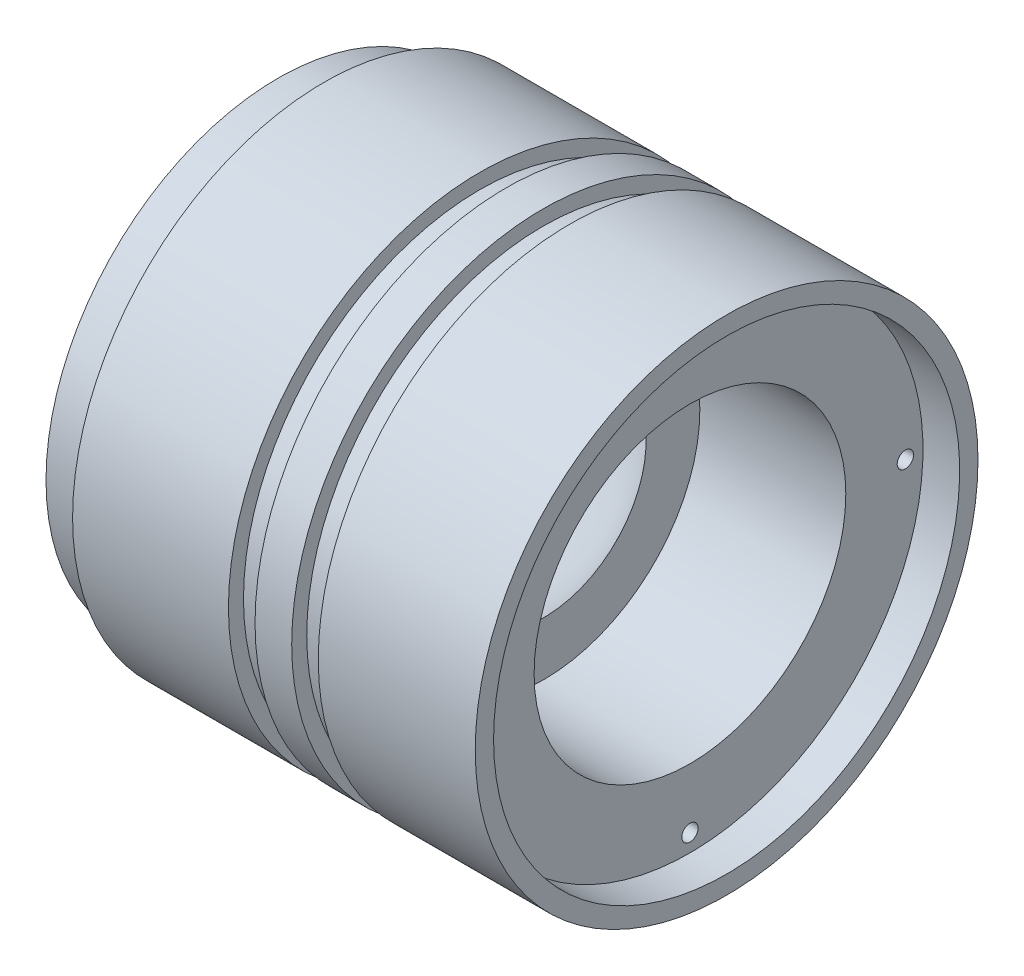
ISO-10303-21;
HEADER;
FILE_DESCRIPTION(('STEP AP214'),'2;1');
FILE_NAME('part.step','',(''),(''),'','','');
FILE_SCHEMA(('AUTOMOTIVE_DESIGN { 1 0 10303 214 1 1 1 1 }'));
ENDSEC;
DATA;
#1=APPLICATION_CONTEXT('core data for automotive mechanical design processes');
#2=APPLICATION_PROTOCOL_DEFINITION('international standard','automotive_design',2000,#1);
#3=PRODUCT_CONTEXT('',#1,'mechanical');
#4=PRODUCT('Part','Part','',(#3));
#5=PRODUCT_RELATED_PRODUCT_CATEGORY('part','',(#4));
#6=PRODUCT_DEFINITION_FORMATION('','',#4);
#7=PRODUCT_DEFINITION_CONTEXT('part definition',#1,'design');
#8=PRODUCT_DEFINITION('design','',#6,#7);
#9=PRODUCT_DEFINITION_SHAPE('','',#8);
#10=(LENGTH_UNIT() NAMED_UNIT(*) SI_UNIT(.MILLI.,.METRE.));
#11=(NAMED_UNIT(*) PLANE_ANGLE_UNIT() SI_UNIT($,.RADIAN.));
#12=(NAMED_UNIT(*) SI_UNIT($,.STERADIAN.) SOLID_ANGLE_UNIT());
#13=UNCERTAINTY_MEASURE_WITH_UNIT(LENGTH_MEASURE(1.E-05),#10,'distance_accuracy_value','');
#14=(GEOMETRIC_REPRESENTATION_CONTEXT(3) GLOBAL_UNCERTAINTY_ASSIGNED_CONTEXT((#13)) GLOBAL_UNIT_ASSIGNED_CONTEXT((#10,
#11,#12)) REPRESENTATION_CONTEXT('',''));
#15=CARTESIAN_POINT('',(0.,0.,0.));
#16=DIRECTION('',(0.,0.,1.));
#17=DIRECTION('',(1.,0.,0.));
#18=AXIS2_PLACEMENT_3D('',#15,#16,#17);
#19=CARTESIAN_POINT('',(-88.99,0.,0.));
#20=DIRECTION('',(-1.,0.,0.));
#21=DIRECTION('',(0.,0.,1.));
#22=AXIS2_PLACEMENT_3D('',#19,#20,#21);
#23=CYLINDRICAL_SURFACE('',#22,34.8234);
#24=CARTESIAN_POINT('',(6.35,0.,0.));
#25=DIRECTION('',(-1.,0.,0.));
#26=DIRECTION('',(0.,0.,1.));
#27=AXIS2_PLACEMENT_3D('',#24,#25,#26);
#28=CIRCLE('',#27,34.8234);
#29=CARTESIAN_POINT('',(6.35,0.,34.8234));
#30=VERTEX_POINT('',#29);
#31=EDGE_CURVE('E112',#30,#30,#28,.T.);
#32=ORIENTED_EDGE('',*,*,#31,.F.);
#33=EDGE_LOOP('',(#32));
#34=FACE_BOUND('',#33,.T.);
#35=CARTESIAN_POINT('',(27.94,0.,0.));
#36=DIRECTION('',(-1.,0.,0.));
#37=DIRECTION('',(0.,0.,1.));
#38=AXIS2_PLACEMENT_3D('',#35,#36,#37);
#39=CIRCLE('',#38,34.8234);
#40=CARTESIAN_POINT('',(27.94,0.,34.8234));
#41=VERTEX_POINT('',#40);
#42=EDGE_CURVE('E170',#41,#41,#39,.T.);
#43=ORIENTED_EDGE('',*,*,#42,.T.);
#44=EDGE_LOOP('',(#43));
#45=FACE_BOUND('',#44,.T.);
#46=ADVANCED_FACE('F38',(#34,#45),#23,.T.);
#47=CARTESIAN_POINT('',(62.1284000000006,0.,0.));
#48=DIRECTION('',(-1.,0.,0.));
#49=DIRECTION('',(0.,0.,1.));
#50=AXIS2_PLACEMENT_3D('',#47,#48,#49);
#51=CIRCLE('',#50,34.8233999999994);
#52=CARTESIAN_POINT('',(62.1284000000006,0.,34.8233999999994));
#53=VERTEX_POINT('',#52);
#54=EDGE_CURVE('E106',#53,#53,#51,.T.);
#55=ORIENTED_EDGE('',*,*,#54,.T.);
#56=EDGE_LOOP('',(#55));
#57=FACE_BOUND('',#56,.T.);
#58=CARTESIAN_POINT('',(40.386,0.,0.));
#59=DIRECTION('',(-1.,0.,0.));
#60=DIRECTION('',(0.,0.,1.));
#61=AXIS2_PLACEMENT_3D('',#58,#59,#60);
#62=CIRCLE('',#61,34.8234);
#63=CARTESIAN_POINT('',(40.386,0.,34.8234));
#64=VERTEX_POINT('',#63);
#65=EDGE_CURVE('E181',#64,#64,#62,.T.);
#66=ORIENTED_EDGE('',*,*,#65,.F.);
#67=EDGE_LOOP('',(#66));
#68=FACE_BOUND('',#67,.T.);
#69=ADVANCED_FACE('F136',(#57,#68),#23,.T.);
#70=CARTESIAN_POINT('',(0.,34.8234,0.));
#71=DIRECTION('',(1.,0.,0.));
#72=DIRECTION('',(0.,0.,-1.));
#73=AXIS2_PLACEMENT_3D('',#70,#71,#72);
#74=PLANE('',#73);
#75=CARTESIAN_POINT('',(0.,0.,0.));
#76=DIRECTION('',(-1.,0.,0.));
#77=DIRECTION('',(0.,0.,1.));
#78=AXIS2_PLACEMENT_3D('',#75,#76,#77);
#79=CIRCLE('',#78,28.4734);
#80=CARTESIAN_POINT('',(0.,0.,28.4734));
#81=VERTEX_POINT('',#80);
#82=EDGE_CURVE('E11',#81,#81,#79,.T.);
#83=ORIENTED_EDGE('',*,*,#82,.F.);
#84=EDGE_LOOP('',(#83));
#85=FACE_BOUND('',#84,.T.);
#86=CARTESIAN_POINT('',(0.,0.,0.));
#87=DIRECTION('',(-1.,0.,0.));
#88=DIRECTION('',(0.,0.,1.));
#89=AXIS2_PLACEMENT_3D('',#86,#87,#88);
#90=CIRCLE('',#89,32.1564);
#91=CARTESIAN_POINT('',(0.,0.,32.1564));
#92=VERTEX_POINT('',#91);
#93=EDGE_CURVE('E118',#92,#92,#90,.T.);
#94=ORIENTED_EDGE('',*,*,#93,.T.);
#95=EDGE_LOOP('',(#94));
#96=FACE_BOUND('',#95,.T.);
#97=ADVANCED_FACE('F40',(#85,#96),#74,.F.);
#98=CARTESIAN_POINT('',(-88.99,0.,0.));
#99=DIRECTION('',(-1.,0.,0.));
#100=DIRECTION('',(0.,0.,1.));
#101=AXIS2_PLACEMENT_3D('',#98,#99,#100);
#102=CYLINDRICAL_SURFACE('',#101,28.4734);
#103=ORIENTED_EDGE('',*,*,#82,.T.);
#104=EDGE_LOOP('',(#103));
#105=FACE_BOUND('',#104,.T.);
#106=CARTESIAN_POINT('',(10.16,0.,0.));
#107=DIRECTION('',(-1.,0.,0.));
#108=DIRECTION('',(0.,0.,1.));
#109=AXIS2_PLACEMENT_3D('',#106,#107,#108);
#110=CIRCLE('',#109,28.4734);
#111=CARTESIAN_POINT('',(10.16,0.,28.4734));
#112=VERTEX_POINT('',#111);
#113=EDGE_CURVE('E46',#112,#112,#110,.T.);
#114=ORIENTED_EDGE('',*,*,#113,.F.);
#115=EDGE_LOOP('',(#114));
#116=FACE_BOUND('',#115,.T.);
#117=ADVANCED_FACE('F126',(#105,#116),#102,.F.);
#118=CARTESIAN_POINT('',(10.16,0.,0.));
#119=DIRECTION('',(-1.,0.,0.));
#120=DIRECTION('',(0.,0.,1.));
#121=AXIS2_PLACEMENT_3D('',#118,#119,#120);
#122=DEGENERATE_TOROIDAL_SURFACE('',#121,3.51918581642672,31.9925858164267,.F.);
#123=ORIENTED_EDGE('',*,*,#113,.T.);
#124=EDGE_LOOP('',(#123));
#125=FACE_BOUND('',#124,.T.);
#126=CARTESIAN_POINT('',(36.83,0.,0.));
#127=DIRECTION('',(-1.,0.,0.));
#128=DIRECTION('',(0.,0.,1.));
#129=AXIS2_PLACEMENT_3D('',#126,#127,#128);
#130=CIRCLE('',#129,14.1510334018351);
#131=CARTESIAN_POINT('',(36.83,0.,14.1510334018351));
#132=VERTEX_POINT('',#131);
#133=EDGE_CURVE('E109',#132,#132,#130,.F.);
#134=ORIENTED_EDGE('',*,*,#133,.T.);
#135=EDGE_LOOP('',(#134));
#136=FACE_BOUND('',#135,.T.);
#137=ADVANCED_FACE('F123',(#125,#136),#122,.T.);
#138=CARTESIAN_POINT('',(-14.4069937020437,0.,0.));
#139=DIRECTION('',(-1.,0.,0.));
#140=DIRECTION('',(0.,0.,1.));
#141=AXIS2_PLACEMENT_3D('',#138,#139,#140);
#142=CYLINDRICAL_SURFACE('',#141,32.1564);
#143=CARTESIAN_POINT('',(6.35,0.,0.));
#144=DIRECTION('',(-1.,0.,0.));
#145=DIRECTION('',(0.,0.,1.));
#146=AXIS2_PLACEMENT_3D('',#143,#144,#145);
#147=CIRCLE('',#146,32.1564);
#148=CARTESIAN_POINT('',(6.35,0.,32.1564));
#149=VERTEX_POINT('',#148);
#150=EDGE_CURVE('E115',#149,#149,#147,.T.);
#151=ORIENTED_EDGE('',*,*,#150,.T.);
#152=EDGE_LOOP('',(#151));
#153=FACE_BOUND('',#152,.T.);
#154=ORIENTED_EDGE('',*,*,#93,.F.);
#155=EDGE_LOOP('',(#154));
#156=FACE_BOUND('',#155,.T.);
#157=ADVANCED_FACE('F134',(#153,#156),#142,.T.);
#158=CARTESIAN_POINT('',(6.35,34.8234,0.));
#159=DIRECTION('',(-1.,0.,0.));
#160=DIRECTION('',(0.,0.,1.));
#161=AXIS2_PLACEMENT_3D('',#158,#159,#160);
#162=PLANE('',#161);
#163=ORIENTED_EDGE('',*,*,#31,.T.);
#164=EDGE_LOOP('',(#163));
#165=FACE_BOUND('',#164,.T.);
#166=ORIENTED_EDGE('',*,*,#150,.F.);
#167=EDGE_LOOP('',(#166));
#168=FACE_BOUND('',#167,.T.);
#169=ADVANCED_FACE('F242',(#165,#168),#162,.T.);
#170=CARTESIAN_POINT('',(62.1284000000006,32.2833999999994,0.));
#171=DIRECTION('',(1.,0.,0.));
#172=DIRECTION('',(0.,0.,-1.));
#173=AXIS2_PLACEMENT_3D('',#170,#171,#172);
#174=PLANE('',#173);
#175=CARTESIAN_POINT('',(62.1284000000006,0.,0.));
#176=DIRECTION('',(-1.,0.,0.));
#177=DIRECTION('',(0.,0.,1.));
#178=AXIS2_PLACEMENT_3D('',#175,#176,#177);
#179=CIRCLE('',#178,32.2833999999994);
#180=CARTESIAN_POINT('',(62.1284000000006,0.,32.2833999999994));
#181=VERTEX_POINT('',#180);
#182=EDGE_CURVE('E103',#181,#181,#179,.T.);
#183=ORIENTED_EDGE('',*,*,#182,.T.);
#184=EDGE_LOOP('',(#183));
#185=FACE_BOUND('',#184,.T.);
#186=ORIENTED_EDGE('',*,*,#54,.F.);
#187=EDGE_LOOP('',(#186));
#188=FACE_BOUND('',#187,.T.);
#189=ADVANCED_FACE('F238',(#185,#188),#174,.T.);
#190=CARTESIAN_POINT('',(-14.4069937020437,0.,0.));
#191=DIRECTION('',(-1.,0.,0.));
#192=DIRECTION('',(0.,0.,1.));
#193=AXIS2_PLACEMENT_3D('',#190,#191,#192);
#194=CYLINDRICAL_SURFACE('',#193,32.2833999999997);
#195=CARTESIAN_POINT('',(57.0484,0.,0.));
#196=DIRECTION('',(-1.,0.,0.));
#197=DIRECTION('',(0.,0.,1.));
#198=AXIS2_PLACEMENT_3D('',#195,#196,#197);
#199=CIRCLE('',#198,32.2834);
#200=CARTESIAN_POINT('',(57.0484,0.,32.2834));
#201=VERTEX_POINT('',#200);
#202=EDGE_CURVE('E100',#201,#201,#199,.T.);
#203=ORIENTED_EDGE('',*,*,#202,.T.);
#204=EDGE_LOOP('',(#203));
#205=FACE_BOUND('',#204,.T.);
#206=ORIENTED_EDGE('',*,*,#182,.F.);
#207=EDGE_LOOP('',(#206));
#208=FACE_BOUND('',#207,.T.);
#209=ADVANCED_FACE('F234',(#205,#208),#194,.F.);
#210=CARTESIAN_POINT('',(57.0484,21.59,0.));
#211=DIRECTION('',(1.,0.,0.));
#212=DIRECTION('',(0.,0.,-1.));
#213=AXIS2_PLACEMENT_3D('',#210,#211,#212);
#214=PLANE('',#213);
#215=CARTESIAN_POINT('',(57.0484,3.1260978167332E-13,-29.845));
#216=DIRECTION('',(1.,0.,0.));
#217=DIRECTION('',(0.,0.,-1.));
#218=AXIS2_PLACEMENT_3D('',#215,#216,#217);
#219=CIRCLE('',#218,1.1303);
#220=CARTESIAN_POINT('',(57.0484,3.1260978167332E-13,-30.9753));
#221=VERTEX_POINT('',#220);
#222=EDGE_CURVE('E70',#221,#221,#219,.T.);
#223=ORIENTED_EDGE('',*,*,#222,.F.);
#224=EDGE_LOOP('',(#223));
#225=FACE_BOUND('',#224,.T.);
#226=CARTESIAN_POINT('',(57.0484,-29.845,0.));
#227=DIRECTION('',(1.,0.,0.));
#228=DIRECTION('',(0.,0.,-1.));
#229=AXIS2_PLACEMENT_3D('',#226,#227,#228);
#230=CIRCLE('',#229,1.1303);
#231=CARTESIAN_POINT('',(57.0484,-29.845,-1.1303));
#232=VERTEX_POINT('',#231);
#233=EDGE_CURVE('E69',#232,#232,#230,.T.);
#234=ORIENTED_EDGE('',*,*,#233,.F.);
#235=EDGE_LOOP('',(#234));
#236=FACE_BOUND('',#235,.T.);
#237=CARTESIAN_POINT('',(57.0484,-1.04203260557773E-13,29.845));
#238=DIRECTION('',(1.,0.,0.));
#239=DIRECTION('',(0.,0.,-1.));
#240=AXIS2_PLACEMENT_3D('',#237,#238,#239);
#241=CIRCLE('',#240,1.1303);
#242=CARTESIAN_POINT('',(57.0484,-1.04203260557773E-13,28.7147));
#243=VERTEX_POINT('',#242);
#244=EDGE_CURVE('E82',#243,#243,#241,.T.);
#245=ORIENTED_EDGE('',*,*,#244,.F.);
#246=EDGE_LOOP('',(#245));
#247=FACE_BOUND('',#246,.T.);
#248=CARTESIAN_POINT('',(57.0484,29.845,0.));
#249=DIRECTION('',(1.,0.,0.));
#250=DIRECTION('',(0.,0.,-1.));
#251=AXIS2_PLACEMENT_3D('',#248,#249,#250);
#252=CIRCLE('',#251,1.1303);
#253=CARTESIAN_POINT('',(57.0484,29.845,-1.1303));
#254=VERTEX_POINT('',#253);
#255=EDGE_CURVE('E88',#254,#254,#252,.T.);
#256=ORIENTED_EDGE('',*,*,#255,.F.);
#257=EDGE_LOOP('',(#256));
#258=FACE_BOUND('',#257,.T.);
#259=CARTESIAN_POINT('',(57.0484,0.,0.));
#260=DIRECTION('',(-1.,0.,0.));
#261=DIRECTION('',(0.,0.,1.));
#262=AXIS2_PLACEMENT_3D('',#259,#260,#261);
#263=CIRCLE('',#262,21.59);
#264=CARTESIAN_POINT('',(57.0484,0.,21.59));
#265=VERTEX_POINT('',#264);
#266=EDGE_CURVE('E97',#265,#265,#263,.T.);
#267=ORIENTED_EDGE('',*,*,#266,.T.);
#268=EDGE_LOOP('',(#267));
#269=FACE_BOUND('',#268,.T.);
#270=ORIENTED_EDGE('',*,*,#202,.F.);
#271=EDGE_LOOP('',(#270));
#272=FACE_BOUND('',#271,.T.);
#273=ADVANCED_FACE('F230',(#225,#236,#247,#258,#269,#272),#214,.T.);
#274=CARTESIAN_POINT('',(-14.4069937020437,0.,0.));
#275=DIRECTION('',(-1.,0.,0.));
#276=DIRECTION('',(0.,0.,1.));
#277=AXIS2_PLACEMENT_3D('',#274,#275,#276);
#278=CYLINDRICAL_SURFACE('',#277,21.59);
#279=CARTESIAN_POINT('',(36.83,0.,0.));
#280=DIRECTION('',(-1.,0.,0.));
#281=DIRECTION('',(0.,0.,1.));
#282=AXIS2_PLACEMENT_3D('',#279,#280,#281);
#283=CIRCLE('',#282,21.59);
#284=CARTESIAN_POINT('',(36.83,0.,21.59));
#285=VERTEX_POINT('',#284);
#286=EDGE_CURVE('E94',#285,#285,#283,.T.);
#287=ORIENTED_EDGE('',*,*,#286,.T.);
#288=EDGE_LOOP('',(#287));
#289=FACE_BOUND('',#288,.T.);
#290=ORIENTED_EDGE('',*,*,#266,.F.);
#291=EDGE_LOOP('',(#290));
#292=FACE_BOUND('',#291,.T.);
#293=ADVANCED_FACE('F226',(#289,#292),#278,.F.);
#294=CARTESIAN_POINT('',(36.83,0.,0.));
#295=DIRECTION('',(1.,0.,0.));
#296=DIRECTION('',(0.,0.,-1.));
#297=AXIS2_PLACEMENT_3D('',#294,#295,#296);
#298=PLANE('',#297);
#299=ORIENTED_EDGE('',*,*,#133,.F.);
#300=EDGE_LOOP('',(#299));
#301=FACE_BOUND('',#300,.T.);
#302=ORIENTED_EDGE('',*,*,#286,.F.);
#303=EDGE_LOOP('',(#302));
#304=FACE_BOUND('',#303,.T.);
#305=ADVANCED_FACE('F223',(#301,#304),#298,.T.);
#306=CARTESIAN_POINT('',(46.8884,29.845,0.));
#307=DIRECTION('',(1.,0.,0.));
#308=DIRECTION('',(0.,0.,-1.));
#309=AXIS2_PLACEMENT_3D('',#306,#307,#308);
#310=CONICAL_SURFACE('',#309,1.1303,1.02974425867666);
#311=CARTESIAN_POINT('',(46.2092472423132,29.845,0.));
#312=VERTEX_POINT('',#311);
#313=VERTEX_LOOP('',#312);
#314=FACE_BOUND('',#313,.T.);
#315=CARTESIAN_POINT('',(46.8884,29.845,0.));
#316=DIRECTION('',(1.,0.,0.));
#317=DIRECTION('',(0.,0.,-1.));
#318=AXIS2_PLACEMENT_3D('',#315,#316,#317);
#319=CIRCLE('',#318,1.1303);
#320=CARTESIAN_POINT('',(46.8884,29.845,-1.1303));
#321=VERTEX_POINT('',#320);
#322=EDGE_CURVE('E91',#321,#321,#319,.T.);
#323=ORIENTED_EDGE('',*,*,#322,.T.);
#324=EDGE_LOOP('',(#323));
#325=FACE_BOUND('',#324,.T.);
#326=ADVANCED_FACE('F219',(#314,#325),#310,.F.);
#327=CARTESIAN_POINT('',(57.0484,29.845,0.));
#328=DIRECTION('',(1.,0.,0.));
#329=DIRECTION('',(0.,0.,-1.));
#330=AXIS2_PLACEMENT_3D('',#327,#328,#329);
#331=CYLINDRICAL_SURFACE('',#330,1.1303);
#332=ORIENTED_EDGE('',*,*,#322,.F.);
#333=EDGE_LOOP('',(#332));
#334=FACE_BOUND('',#333,.T.);
#335=ORIENTED_EDGE('',*,*,#255,.T.);
#336=EDGE_LOOP('',(#335));
#337=FACE_BOUND('',#336,.T.);
#338=ADVANCED_FACE('F216',(#334,#337),#331,.F.);
#339=CARTESIAN_POINT('',(46.8884,-1.04203260557773E-13,29.845));
#340=DIRECTION('',(1.,0.,0.));
#341=DIRECTION('',(0.,0.,-1.));
#342=AXIS2_PLACEMENT_3D('',#339,#340,#341);
#343=CONICAL_SURFACE('',#342,1.1303,1.02974425867666);
#344=CARTESIAN_POINT('',(46.2092472423132,-1.06858087303807E-13,29.845));
#345=VERTEX_POINT('',#344);
#346=VERTEX_LOOP('',#345);
#347=FACE_BOUND('',#346,.T.);
#348=CARTESIAN_POINT('',(46.8884,-1.04203260557773E-13,29.845));
#349=DIRECTION('',(1.,0.,0.));
#350=DIRECTION('',(0.,0.,-1.));
#351=AXIS2_PLACEMENT_3D('',#348,#349,#350);
#352=CIRCLE('',#351,1.1303);
#353=CARTESIAN_POINT('',(46.8884,-1.04203260557773E-13,28.7147));
#354=VERTEX_POINT('',#353);
#355=EDGE_CURVE('E85',#354,#354,#352,.T.);
#356=ORIENTED_EDGE('',*,*,#355,.T.);
#357=EDGE_LOOP('',(#356));
#358=FACE_BOUND('',#357,.T.);
#359=ADVANCED_FACE('F212',(#347,#358),#343,.F.);
#360=CARTESIAN_POINT('',(57.0484,-1.04203260557773E-13,29.845));
#361=DIRECTION('',(1.,0.,0.));
#362=DIRECTION('',(0.,0.,-1.));
#363=AXIS2_PLACEMENT_3D('',#360,#361,#362);
#364=CYLINDRICAL_SURFACE('',#363,1.1303);
#365=ORIENTED_EDGE('',*,*,#355,.F.);
#366=EDGE_LOOP('',(#365));
#367=FACE_BOUND('',#366,.T.);
#368=ORIENTED_EDGE('',*,*,#244,.T.);
#369=EDGE_LOOP('',(#368));
#370=FACE_BOUND('',#369,.T.);
#371=ADVANCED_FACE('F208',(#367,#370),#364,.F.);
#372=CARTESIAN_POINT('',(46.8884,-29.845,0.));
#373=DIRECTION('',(1.,0.,0.));
#374=DIRECTION('',(0.,0.,-1.));
#375=AXIS2_PLACEMENT_3D('',#372,#373,#374);
#376=CONICAL_SURFACE('',#375,1.1303,1.02974425867666);
#377=CARTESIAN_POINT('',(46.2092472423132,-29.845,0.));
#378=VERTEX_POINT('',#377);
#379=VERTEX_LOOP('',#378);
#380=FACE_BOUND('',#379,.T.);
#381=CARTESIAN_POINT('',(46.8884,-29.845,0.));
#382=DIRECTION('',(1.,0.,0.));
#383=DIRECTION('',(0.,0.,-1.));
#384=AXIS2_PLACEMENT_3D('',#381,#382,#383);
#385=CIRCLE('',#384,1.1303);
#386=CARTESIAN_POINT('',(46.8884,-29.845,-1.1303));
#387=VERTEX_POINT('',#386);
#388=EDGE_CURVE('E73',#387,#387,#385,.T.);
#389=ORIENTED_EDGE('',*,*,#388,.T.);
#390=EDGE_LOOP('',(#389));
#391=FACE_BOUND('',#390,.T.);
#392=ADVANCED_FACE('F204',(#380,#391),#376,.F.);
#393=CARTESIAN_POINT('',(57.0484,-29.845,0.));
#394=DIRECTION('',(1.,0.,0.));
#395=DIRECTION('',(0.,0.,-1.));
#396=AXIS2_PLACEMENT_3D('',#393,#394,#395);
#397=CYLINDRICAL_SURFACE('',#396,1.1303);
#398=ORIENTED_EDGE('',*,*,#388,.F.);
#399=EDGE_LOOP('',(#398));
#400=FACE_BOUND('',#399,.T.);
#401=ORIENTED_EDGE('',*,*,#233,.T.);
#402=EDGE_LOOP('',(#401));
#403=FACE_BOUND('',#402,.T.);
#404=ADVANCED_FACE('F63',(#400,#403),#397,.F.);
#405=CARTESIAN_POINT('',(46.8884,3.1260978167332E-13,-29.845));
#406=DIRECTION('',(1.,0.,0.));
#407=DIRECTION('',(0.,0.,-1.));
#408=AXIS2_PLACEMENT_3D('',#405,#406,#407);
#409=CONICAL_SURFACE('',#408,1.1303,1.02974425867666);
#410=CARTESIAN_POINT('',(46.2092472423132,3.09954954927286E-13,-29.845));
#411=VERTEX_POINT('',#410);
#412=VERTEX_LOOP('',#411);
#413=FACE_BOUND('',#412,.T.);
#414=CARTESIAN_POINT('',(46.8884,3.1260978167332E-13,-29.845));
#415=DIRECTION('',(1.,0.,0.));
#416=DIRECTION('',(0.,0.,-1.));
#417=AXIS2_PLACEMENT_3D('',#414,#415,#416);
#418=CIRCLE('',#417,1.1303);
#419=CARTESIAN_POINT('',(46.8884,3.1260978167332E-13,-30.9753));
#420=VERTEX_POINT('',#419);
#421=EDGE_CURVE('E67',#420,#420,#418,.T.);
#422=ORIENTED_EDGE('',*,*,#421,.T.);
#423=EDGE_LOOP('',(#422));
#424=FACE_BOUND('',#423,.T.);
#425=ADVANCED_FACE('F59',(#413,#424),#409,.F.);
#426=CARTESIAN_POINT('',(57.0484,3.1260978167332E-13,-29.845));
#427=DIRECTION('',(1.,0.,0.));
#428=DIRECTION('',(0.,0.,-1.));
#429=AXIS2_PLACEMENT_3D('',#426,#427,#428);
#430=CYLINDRICAL_SURFACE('',#429,1.1303);
#431=ORIENTED_EDGE('',*,*,#421,.F.);
#432=EDGE_LOOP('',(#431));
#433=FACE_BOUND('',#432,.T.);
#434=ORIENTED_EDGE('',*,*,#222,.T.);
#435=EDGE_LOOP('',(#434));
#436=FACE_BOUND('',#435,.T.);
#437=ADVANCED_FACE('F62',(#433,#436),#430,.F.);
#438=CARTESIAN_POINT('',(36.703,34.8234,0.));
#439=DIRECTION('',(1.,0.,0.));
#440=DIRECTION('',(0.,0.,-1.));
#441=AXIS2_PLACEMENT_3D('',#438,#439,#440);
#442=PLANE('',#441);
#443=CARTESIAN_POINT('',(36.703,0.,0.));
#444=DIRECTION('',(-1.,0.,0.));
#445=DIRECTION('',(0.,0.,1.));
#446=AXIS2_PLACEMENT_3D('',#443,#444,#445);
#447=CIRCLE('',#446,32.7406);
#448=CARTESIAN_POINT('',(36.703,0.,32.7406));
#449=VERTEX_POINT('',#448);
#450=EDGE_CURVE('E175',#449,#449,#447,.T.);
#451=ORIENTED_EDGE('',*,*,#450,.T.);
#452=EDGE_LOOP('',(#451));
#453=FACE_BOUND('',#452,.T.);
#454=CARTESIAN_POINT('',(36.703,0.,0.));
#455=DIRECTION('',(-1.,0.,0.));
#456=DIRECTION('',(0.,0.,1.));
#457=AXIS2_PLACEMENT_3D('',#454,#455,#456);
#458=CIRCLE('',#457,34.8234);
#459=CARTESIAN_POINT('',(36.703,0.,34.8234));
#460=VERTEX_POINT('',#459);
#461=EDGE_CURVE('E164',#460,#460,#458,.T.);
#462=ORIENTED_EDGE('',*,*,#461,.F.);
#463=EDGE_LOOP('',(#462));
#464=FACE_BOUND('',#463,.T.);
#465=ADVANCED_FACE('F189',(#453,#464),#442,.T.);
#466=CARTESIAN_POINT('',(-14.4069937020437,0.,0.));
#467=DIRECTION('',(-1.,0.,0.));
#468=DIRECTION('',(0.,0.,1.));
#469=AXIS2_PLACEMENT_3D('',#466,#467,#468);
#470=CYLINDRICAL_SURFACE('',#469,32.7406);
#471=CARTESIAN_POINT('',(40.386,0.,0.));
#472=DIRECTION('',(-1.,0.,0.));
#473=DIRECTION('',(0.,0.,1.));
#474=AXIS2_PLACEMENT_3D('',#471,#472,#473);
#475=CIRCLE('',#474,32.7406);
#476=CARTESIAN_POINT('',(40.386,0.,32.7406));
#477=VERTEX_POINT('',#476);
#478=EDGE_CURVE('E184',#477,#477,#475,.T.);
#479=ORIENTED_EDGE('',*,*,#478,.T.);
#480=EDGE_LOOP('',(#479));
#481=FACE_BOUND('',#480,.T.);
#482=ORIENTED_EDGE('',*,*,#450,.F.);
#483=EDGE_LOOP('',(#482));
#484=FACE_BOUND('',#483,.T.);
#485=ADVANCED_FACE('F158',(#481,#484),#470,.T.);
#486=CARTESIAN_POINT('',(40.386,34.8234,0.));
#487=DIRECTION('',(-1.,0.,0.));
#488=DIRECTION('',(0.,0.,1.));
#489=AXIS2_PLACEMENT_3D('',#486,#487,#488);
#490=PLANE('',#489);
#491=ORIENTED_EDGE('',*,*,#65,.T.);
#492=EDGE_LOOP('',(#491));
#493=FACE_BOUND('',#492,.T.);
#494=ORIENTED_EDGE('',*,*,#478,.F.);
#495=EDGE_LOOP('',(#494));
#496=FACE_BOUND('',#495,.T.);
#497=ADVANCED_FACE('F149',(#493,#496),#490,.T.);
#498=ORIENTED_EDGE('',*,*,#461,.T.);
#499=EDGE_LOOP('',(#498));
#500=FACE_BOUND('',#499,.T.);
#501=CARTESIAN_POINT('',(31.623,0.,0.));
#502=DIRECTION('',(-1.,0.,0.));
#503=DIRECTION('',(0.,0.,1.));
#504=AXIS2_PLACEMENT_3D('',#501,#502,#503);
#505=CIRCLE('',#504,34.8234);
#506=CARTESIAN_POINT('',(31.623,0.,34.8234));
#507=VERTEX_POINT('',#506);
#508=EDGE_CURVE('E167',#507,#507,#505,.T.);
#509=ORIENTED_EDGE('',*,*,#508,.F.);
#510=EDGE_LOOP('',(#509));
#511=FACE_BOUND('',#510,.T.);
#512=ADVANCED_FACE('F140',(#500,#511),#23,.T.);
#513=CARTESIAN_POINT('',(27.94,34.8234,0.));
#514=DIRECTION('',(1.,0.,0.));
#515=DIRECTION('',(0.,0.,-1.));
#516=AXIS2_PLACEMENT_3D('',#513,#514,#515);
#517=PLANE('',#516);
#518=CARTESIAN_POINT('',(27.94,0.,0.));
#519=DIRECTION('',(-1.,0.,0.));
#520=DIRECTION('',(0.,0.,1.));
#521=AXIS2_PLACEMENT_3D('',#518,#519,#520);
#522=CIRCLE('',#521,32.7406);
#523=CARTESIAN_POINT('',(27.94,0.,32.7406));
#524=VERTEX_POINT('',#523);
#525=EDGE_CURVE('E76',#524,#524,#522,.T.);
#526=ORIENTED_EDGE('',*,*,#525,.T.);
#527=EDGE_LOOP('',(#526));
#528=FACE_BOUND('',#527,.T.);
#529=ORIENTED_EDGE('',*,*,#42,.F.);
#530=EDGE_LOOP('',(#529));
#531=FACE_BOUND('',#530,.T.);
#532=ADVANCED_FACE('F148',(#528,#531),#517,.T.);
#533=CARTESIAN_POINT('',(-14.4069937020437,0.,0.));
#534=DIRECTION('',(-1.,0.,0.));
#535=DIRECTION('',(0.,0.,1.));
#536=AXIS2_PLACEMENT_3D('',#533,#534,#535);
#537=CYLINDRICAL_SURFACE('',#536,32.7406);
#538=CARTESIAN_POINT('',(31.623,0.,0.));
#539=DIRECTION('',(-1.,0.,0.));
#540=DIRECTION('',(0.,0.,1.));
#541=AXIS2_PLACEMENT_3D('',#538,#539,#540);
#542=CIRCLE('',#541,32.7406);
#543=CARTESIAN_POINT('',(31.623,0.,32.7406));
#544=VERTEX_POINT('',#543);
#545=EDGE_CURVE('E169',#544,#544,#542,.T.);
#546=ORIENTED_EDGE('',*,*,#545,.T.);
#547=EDGE_LOOP('',(#546));
#548=FACE_BOUND('',#547,.T.);
#549=ORIENTED_EDGE('',*,*,#525,.F.);
#550=EDGE_LOOP('',(#549));
#551=FACE_BOUND('',#550,.T.);
#552=ADVANCED_FACE('F155',(#548,#551),#537,.T.);
#553=CARTESIAN_POINT('',(31.623,34.8234,0.));
#554=DIRECTION('',(-1.,0.,0.));
#555=DIRECTION('',(0.,0.,1.));
#556=AXIS2_PLACEMENT_3D('',#553,#554,#555);
#557=PLANE('',#556);
#558=ORIENTED_EDGE('',*,*,#508,.T.);
#559=EDGE_LOOP('',(#558));
#560=FACE_BOUND('',#559,.T.);
#561=ORIENTED_EDGE('',*,*,#545,.F.);
#562=EDGE_LOOP('',(#561));
#563=FACE_BOUND('',#562,.T.);
#564=ADVANCED_FACE('F356',(#560,#563),#557,.T.);
#565=CLOSED_SHELL('',(#46,#69,#97,#117,#137,#157,#169,#189,#209,#273,#293,#305,#326,#338,#359,
#371,#392,#404,#425,#437,#465,#485,#497,#512,#532,#552,#564));
#566=MANIFOLD_SOLID_BREP('B2',#565);
#567=ADVANCED_BREP_SHAPE_REPRESENTATION('',(#18,#566),#14);
#568=SHAPE_DEFINITION_REPRESENTATION(#9,#567);
ENDSEC;
END-ISO-10303-21;
